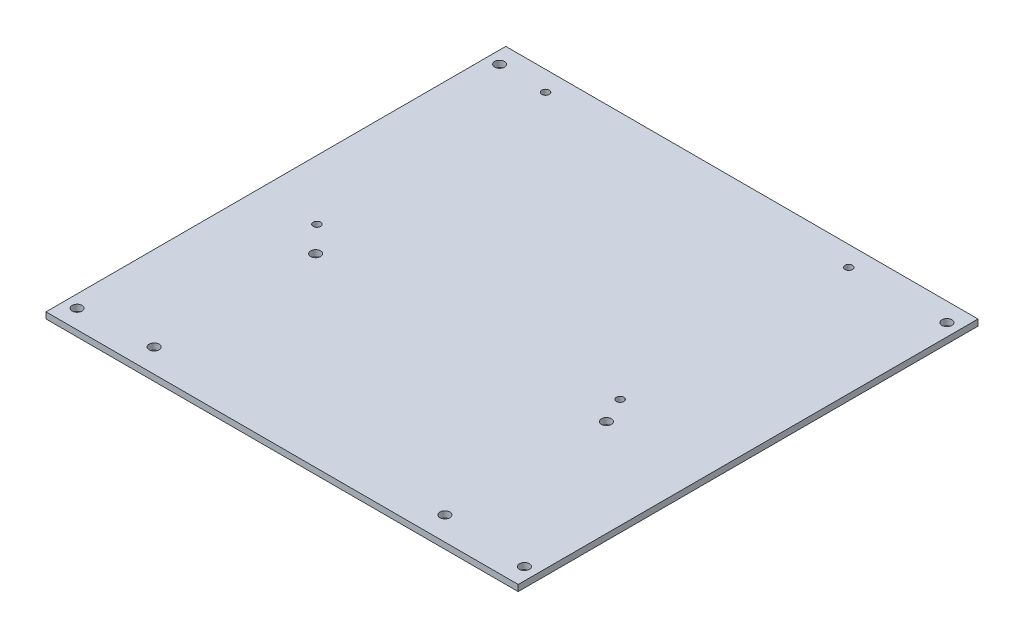
ISO-10303-21;
HEADER;
FILE_DESCRIPTION(('STEP AP214'),'2;1');
FILE_NAME('part.step','',(''),(''),'','','');
FILE_SCHEMA(('AUTOMOTIVE_DESIGN { 1 0 10303 214 1 1 1 1 }'));
ENDSEC;
DATA;
#1=APPLICATION_CONTEXT('core data for automotive mechanical design processes');
#2=APPLICATION_PROTOCOL_DEFINITION('international standard','automotive_design',2000,#1);
#3=PRODUCT_CONTEXT('',#1,'mechanical');
#4=PRODUCT('Part','Part','',(#3));
#5=PRODUCT_RELATED_PRODUCT_CATEGORY('part','',(#4));
#6=PRODUCT_DEFINITION_FORMATION('','',#4);
#7=PRODUCT_DEFINITION_CONTEXT('part definition',#1,'design');
#8=PRODUCT_DEFINITION('design','',#6,#7);
#9=PRODUCT_DEFINITION_SHAPE('','',#8);
#10=(LENGTH_UNIT() NAMED_UNIT(*) SI_UNIT(.MILLI.,.METRE.));
#11=(NAMED_UNIT(*) PLANE_ANGLE_UNIT() SI_UNIT($,.RADIAN.));
#12=(NAMED_UNIT(*) SI_UNIT($,.STERADIAN.) SOLID_ANGLE_UNIT());
#13=UNCERTAINTY_MEASURE_WITH_UNIT(LENGTH_MEASURE(1.E-05),#10,'distance_accuracy_value','');
#14=(GEOMETRIC_REPRESENTATION_CONTEXT(3) GLOBAL_UNCERTAINTY_ASSIGNED_CONTEXT((#13)) GLOBAL_UNIT_ASSIGNED_CONTEXT((#10,
#11,#12)) REPRESENTATION_CONTEXT('',''));
#15=CARTESIAN_POINT('',(0.,0.,0.));
#16=DIRECTION('',(0.,0.,1.));
#17=DIRECTION('',(1.,0.,0.));
#18=AXIS2_PLACEMENT_3D('',#15,#16,#17);
#19=CARTESIAN_POINT('',(95.,2.5,92.5));
#20=DIRECTION('',(-1.,0.,0.));
#21=DIRECTION('',(0.,0.,1.));
#22=AXIS2_PLACEMENT_3D('',#19,#20,#21);
#23=PLANE('',#22);
#24=DIRECTION('',(0.,0.,-1.));
#25=VECTOR('',#24,1.);
#26=CARTESIAN_POINT('',(95.,0.,92.5));
#27=LINE('',#26,#25);
#28=CARTESIAN_POINT('',(95.,0.,92.5));
#29=VERTEX_POINT('',#28);
#30=CARTESIAN_POINT('',(95.,0.,-92.5));
#31=VERTEX_POINT('',#30);
#32=EDGE_CURVE('E99',#29,#31,#27,.T.);
#33=ORIENTED_EDGE('',*,*,#32,.T.);
#34=DIRECTION('',(0.,-1.,0.));
#35=VECTOR('',#34,1.);
#36=CARTESIAN_POINT('',(95.,2.5,-92.5));
#37=LINE('',#36,#35);
#38=CARTESIAN_POINT('',(95.,2.5,-92.5));
#39=VERTEX_POINT('',#38);
#40=EDGE_CURVE('E11',#39,#31,#37,.T.);
#41=ORIENTED_EDGE('',*,*,#40,.F.);
#42=DIRECTION('',(0.,0.,-1.));
#43=VECTOR('',#42,1.);
#44=CARTESIAN_POINT('',(95.,2.5,92.5));
#45=LINE('',#44,#43);
#46=CARTESIAN_POINT('',(95.,2.5,92.5));
#47=VERTEX_POINT('',#46);
#48=EDGE_CURVE('E86',#47,#39,#45,.T.);
#49=ORIENTED_EDGE('',*,*,#48,.F.);
#50=DIRECTION('',(0.,-1.,0.));
#51=VECTOR('',#50,1.);
#52=CARTESIAN_POINT('',(95.,2.5,92.5));
#53=LINE('',#52,#51);
#54=EDGE_CURVE('E95',#47,#29,#53,.T.);
#55=ORIENTED_EDGE('',*,*,#54,.T.);
#56=EDGE_LOOP('',(#33,#41,#49,#55));
#57=FACE_BOUND('',#56,.T.);
#58=ADVANCED_FACE('F33',(#57),#23,.F.);
#59=CARTESIAN_POINT('',(-95.,2.5,-92.5));
#60=DIRECTION('',(0.,0.,1.));
#61=DIRECTION('',(1.,0.,0.));
#62=AXIS2_PLACEMENT_3D('',#59,#60,#61);
#63=PLANE('',#62);
#64=DIRECTION('',(-1.,0.,0.));
#65=VECTOR('',#64,1.);
#66=CARTESIAN_POINT('',(-95.,0.,-92.5));
#67=LINE('',#66,#65);
#68=CARTESIAN_POINT('',(-95.,0.,-92.5));
#69=VERTEX_POINT('',#68);
#70=EDGE_CURVE('E90',#31,#69,#67,.T.);
#71=ORIENTED_EDGE('',*,*,#70,.T.);
#72=DIRECTION('',(0.,-1.,0.));
#73=VECTOR('',#72,1.);
#74=CARTESIAN_POINT('',(-95.,2.5,-92.5));
#75=LINE('',#74,#73);
#76=CARTESIAN_POINT('',(-95.,2.5,-92.5));
#77=VERTEX_POINT('',#76);
#78=EDGE_CURVE('E42',#77,#69,#75,.T.);
#79=ORIENTED_EDGE('',*,*,#78,.F.);
#80=DIRECTION('',(-1.,0.,0.));
#81=VECTOR('',#80,1.);
#82=CARTESIAN_POINT('',(-95.,2.5,-92.5));
#83=LINE('',#82,#81);
#84=EDGE_CURVE('E81',#39,#77,#83,.T.);
#85=ORIENTED_EDGE('',*,*,#84,.F.);
#86=ORIENTED_EDGE('',*,*,#40,.T.);
#87=EDGE_LOOP('',(#71,#79,#85,#86));
#88=FACE_BOUND('',#87,.T.);
#89=ADVANCED_FACE('F89',(#88),#63,.F.);
#90=CARTESIAN_POINT('',(-95.,2.5,92.5));
#91=DIRECTION('',(1.,0.,0.));
#92=DIRECTION('',(0.,0.,-1.));
#93=AXIS2_PLACEMENT_3D('',#90,#91,#92);
#94=PLANE('',#93);
#95=DIRECTION('',(0.,0.,1.));
#96=VECTOR('',#95,1.);
#97=CARTESIAN_POINT('',(-95.,0.,92.5));
#98=LINE('',#97,#96);
#99=CARTESIAN_POINT('',(-95.,0.,92.5));
#100=VERTEX_POINT('',#99);
#101=EDGE_CURVE('E68',#69,#100,#98,.T.);
#102=ORIENTED_EDGE('',*,*,#101,.T.);
#103=DIRECTION('',(0.,-1.,0.));
#104=VECTOR('',#103,1.);
#105=CARTESIAN_POINT('',(-95.,2.5,92.5));
#106=LINE('',#105,#104);
#107=CARTESIAN_POINT('',(-95.,2.5,92.5));
#108=VERTEX_POINT('',#107);
#109=EDGE_CURVE('E91',#108,#100,#106,.T.);
#110=ORIENTED_EDGE('',*,*,#109,.F.);
#111=DIRECTION('',(0.,0.,1.));
#112=VECTOR('',#111,1.);
#113=CARTESIAN_POINT('',(-95.,2.5,92.5));
#114=LINE('',#113,#112);
#115=EDGE_CURVE('E84',#77,#108,#114,.T.);
#116=ORIENTED_EDGE('',*,*,#115,.F.);
#117=ORIENTED_EDGE('',*,*,#78,.T.);
#118=EDGE_LOOP('',(#102,#110,#116,#117));
#119=FACE_BOUND('',#118,.T.);
#120=ADVANCED_FACE('F93',(#119),#94,.F.);
#121=CARTESIAN_POINT('',(-95.,2.5,92.5));
#122=DIRECTION('',(0.,0.,-1.));
#123=DIRECTION('',(-1.,0.,0.));
#124=AXIS2_PLACEMENT_3D('',#121,#122,#123);
#125=PLANE('',#124);
#126=DIRECTION('',(1.,0.,0.));
#127=VECTOR('',#126,1.);
#128=CARTESIAN_POINT('',(-95.,0.,92.5));
#129=LINE('',#128,#127);
#130=EDGE_CURVE('E74',#100,#29,#129,.T.);
#131=ORIENTED_EDGE('',*,*,#130,.T.);
#132=ORIENTED_EDGE('',*,*,#54,.F.);
#133=DIRECTION('',(1.,0.,0.));
#134=VECTOR('',#133,1.);
#135=CARTESIAN_POINT('',(-95.,2.5,92.5));
#136=LINE('',#135,#134);
#137=EDGE_CURVE('E51',#108,#47,#136,.T.);
#138=ORIENTED_EDGE('',*,*,#137,.F.);
#139=ORIENTED_EDGE('',*,*,#109,.T.);
#140=EDGE_LOOP('',(#131,#132,#138,#139));
#141=FACE_BOUND('',#140,.T.);
#142=ADVANCED_FACE('F175',(#141),#125,.F.);
#143=CARTESIAN_POINT('',(0.,2.5,0.));
#144=DIRECTION('',(0.,-1.,0.));
#145=DIRECTION('',(0.,0.,-1.));
#146=AXIS2_PLACEMENT_3D('',#143,#144,#145);
#147=PLANE('',#146);
#148=CARTESIAN_POINT('',(-70.999999999999,2.5,7.50000000000001));
#149=DIRECTION('',(0.,1.,0.));
#150=DIRECTION('',(0.,0.,1.));
#151=AXIS2_PLACEMENT_3D('',#148,#149,#150);
#152=CIRCLE('',#151,1.5);
#153=CARTESIAN_POINT('',(-70.999999999999,2.5,9.00000000000001));
#154=VERTEX_POINT('',#153);
#155=EDGE_CURVE('E337',#154,#154,#152,.T.);
#156=ORIENTED_EDGE('',*,*,#155,.F.);
#157=EDGE_LOOP('',(#156));
#158=FACE_BOUND('',#157,.T.);
#159=CARTESIAN_POINT('',(51.0000000000009,2.5,7.50000000000001));
#160=DIRECTION('',(0.,1.,0.));
#161=DIRECTION('',(0.,0.,1.));
#162=AXIS2_PLACEMENT_3D('',#159,#160,#161);
#163=CIRCLE('',#162,1.5);
#164=CARTESIAN_POINT('',(51.0000000000009,2.5,9.00000000000001));
#165=VERTEX_POINT('',#164);
#166=EDGE_CURVE('E338',#165,#165,#163,.T.);
#167=ORIENTED_EDGE('',*,*,#166,.F.);
#168=EDGE_LOOP('',(#167));
#169=FACE_BOUND('',#168,.T.);
#170=CARTESIAN_POINT('',(51.,2.5,-84.5));
#171=DIRECTION('',(0.,1.,0.));
#172=DIRECTION('',(0.,0.,1.));
#173=AXIS2_PLACEMENT_3D('',#170,#171,#172);
#174=CIRCLE('',#173,1.5);
#175=CARTESIAN_POINT('',(51.,2.5,-83.));
#176=VERTEX_POINT('',#175);
#177=EDGE_CURVE('E341',#176,#176,#174,.T.);
#178=ORIENTED_EDGE('',*,*,#177,.F.);
#179=EDGE_LOOP('',(#178));
#180=FACE_BOUND('',#179,.T.);
#181=CARTESIAN_POINT('',(-71.,2.5,-84.5));
#182=DIRECTION('',(0.,1.,0.));
#183=DIRECTION('',(0.,0.,1.));
#184=AXIS2_PLACEMENT_3D('',#181,#182,#183);
#185=CIRCLE('',#184,1.5);
#186=CARTESIAN_POINT('',(-71.,2.5,-83.));
#187=VERTEX_POINT('',#186);
#188=EDGE_CURVE('E138',#187,#187,#185,.T.);
#189=ORIENTED_EDGE('',*,*,#188,.F.);
#190=EDGE_LOOP('',(#189));
#191=FACE_BOUND('',#190,.T.);
#192=CARTESIAN_POINT('',(55.9999999999998,2.5,18.));
#193=DIRECTION('',(0.,1.,0.));
#194=DIRECTION('',(0.,0.,1.));
#195=AXIS2_PLACEMENT_3D('',#192,#193,#194);
#196=CIRCLE('',#195,2.);
#197=CARTESIAN_POINT('',(55.9999999999998,2.5,20.));
#198=VERTEX_POINT('',#197);
#199=EDGE_CURVE('E145',#198,#198,#196,.T.);
#200=ORIENTED_EDGE('',*,*,#199,.F.);
#201=EDGE_LOOP('',(#200));
#202=FACE_BOUND('',#201,.T.);
#203=CARTESIAN_POINT('',(-61.0000000000002,2.5,18.0000000000008));
#204=DIRECTION('',(0.,1.,0.));
#205=DIRECTION('',(0.,0.,1.));
#206=AXIS2_PLACEMENT_3D('',#203,#204,#205);
#207=CIRCLE('',#206,2.);
#208=CARTESIAN_POINT('',(-61.0000000000002,2.5,20.0000000000008));
#209=VERTEX_POINT('',#208);
#210=EDGE_CURVE('E149',#209,#209,#207,.T.);
#211=ORIENTED_EDGE('',*,*,#210,.F.);
#212=EDGE_LOOP('',(#211));
#213=FACE_BOUND('',#212,.T.);
#214=CARTESIAN_POINT('',(-61.,2.5,83.0000000000008));
#215=DIRECTION('',(0.,1.,0.));
#216=DIRECTION('',(0.,0.,1.));
#217=AXIS2_PLACEMENT_3D('',#214,#215,#216);
#218=CIRCLE('',#217,2.);
#219=CARTESIAN_POINT('',(-61.,2.5,85.0000000000008));
#220=VERTEX_POINT('',#219);
#221=EDGE_CURVE('E154',#220,#220,#218,.T.);
#222=ORIENTED_EDGE('',*,*,#221,.F.);
#223=EDGE_LOOP('',(#222));
#224=FACE_BOUND('',#223,.T.);
#225=CARTESIAN_POINT('',(56.,2.5,83.));
#226=DIRECTION('',(0.,1.,0.));
#227=DIRECTION('',(0.,0.,1.));
#228=AXIS2_PLACEMENT_3D('',#225,#226,#227);
#229=CIRCLE('',#228,2.);
#230=CARTESIAN_POINT('',(56.,2.5,85.));
#231=VERTEX_POINT('',#230);
#232=EDGE_CURVE('E124',#231,#231,#229,.T.);
#233=ORIENTED_EDGE('',*,*,#232,.F.);
#234=EDGE_LOOP('',(#233));
#235=FACE_BOUND('',#234,.T.);
#236=CARTESIAN_POINT('',(90.0000000000018,2.5,84.9999999999987));
#237=DIRECTION('',(0.,1.,0.));
#238=DIRECTION('',(0.,0.,1.));
#239=AXIS2_PLACEMENT_3D('',#236,#237,#238);
#240=CIRCLE('',#239,2.);
#241=CARTESIAN_POINT('',(90.0000000000018,2.5,86.9999999999987));
#242=VERTEX_POINT('',#241);
#243=EDGE_CURVE('E133',#242,#242,#240,.T.);
#244=ORIENTED_EDGE('',*,*,#243,.F.);
#245=EDGE_LOOP('',(#244));
#246=FACE_BOUND('',#245,.T.);
#247=CARTESIAN_POINT('',(-89.9999999999982,2.5,85.));
#248=DIRECTION('',(0.,1.,0.));
#249=DIRECTION('',(0.,0.,1.));
#250=AXIS2_PLACEMENT_3D('',#247,#248,#249);
#251=CIRCLE('',#250,2.);
#252=CARTESIAN_POINT('',(-89.9999999999982,2.5,87.));
#253=VERTEX_POINT('',#252);
#254=EDGE_CURVE('E163',#253,#253,#251,.T.);
#255=ORIENTED_EDGE('',*,*,#254,.F.);
#256=EDGE_LOOP('',(#255));
#257=FACE_BOUND('',#256,.T.);
#258=CARTESIAN_POINT('',(-90.,2.5,-84.9999999999987));
#259=DIRECTION('',(0.,1.,0.));
#260=DIRECTION('',(0.,0.,1.));
#261=AXIS2_PLACEMENT_3D('',#258,#259,#260);
#262=CIRCLE('',#261,2.);
#263=CARTESIAN_POINT('',(-90.,2.5,-82.9999999999987));
#264=VERTEX_POINT('',#263);
#265=EDGE_CURVE('E160',#264,#264,#262,.T.);
#266=ORIENTED_EDGE('',*,*,#265,.F.);
#267=EDGE_LOOP('',(#266));
#268=FACE_BOUND('',#267,.T.);
#269=CARTESIAN_POINT('',(90.,2.5,-85.));
#270=DIRECTION('',(0.,1.,0.));
#271=DIRECTION('',(0.,0.,1.));
#272=AXIS2_PLACEMENT_3D('',#269,#270,#271);
#273=CIRCLE('',#272,2.);
#274=CARTESIAN_POINT('',(90.,2.5,-83.));
#275=VERTEX_POINT('',#274);
#276=EDGE_CURVE('E112',#275,#275,#273,.T.);
#277=ORIENTED_EDGE('',*,*,#276,.F.);
#278=EDGE_LOOP('',(#277));
#279=FACE_BOUND('',#278,.T.);
#280=ORIENTED_EDGE('',*,*,#48,.T.);
#281=ORIENTED_EDGE('',*,*,#84,.T.);
#282=ORIENTED_EDGE('',*,*,#115,.T.);
#283=ORIENTED_EDGE('',*,*,#137,.T.);
#284=EDGE_LOOP('',(#280,#281,#282,#283));
#285=FACE_BOUND('',#284,.T.);
#286=ADVANCED_FACE('F82',(#158,#169,#180,#191,#202,#213,#224,#235,#246,#257,#268,#279,#285),
#147,.F.);
#287=CARTESIAN_POINT('',(0.,0.,0.));
#288=DIRECTION('',(0.,-1.,0.));
#289=DIRECTION('',(0.,0.,-1.));
#290=AXIS2_PLACEMENT_3D('',#287,#288,#289);
#291=PLANE('',#290);
#292=CARTESIAN_POINT('',(-70.999999999999,0.,7.50000000000001));
#293=DIRECTION('',(0.,-1.,0.));
#294=DIRECTION('',(0.,0.,-1.));
#295=AXIS2_PLACEMENT_3D('',#292,#293,#294);
#296=CIRCLE('',#295,1.5);
#297=CARTESIAN_POINT('',(-70.999999999999,0.,6.00000000000001));
#298=VERTEX_POINT('',#297);
#299=EDGE_CURVE('E36',#298,#298,#296,.T.);
#300=ORIENTED_EDGE('',*,*,#299,.F.);
#301=EDGE_LOOP('',(#300));
#302=FACE_BOUND('',#301,.T.);
#303=CARTESIAN_POINT('',(51.0000000000009,0.,7.50000000000001));
#304=DIRECTION('',(0.,-1.,0.));
#305=DIRECTION('',(0.,0.,-1.));
#306=AXIS2_PLACEMENT_3D('',#303,#304,#305);
#307=CIRCLE('',#306,1.5);
#308=CARTESIAN_POINT('',(51.0000000000009,0.,6.00000000000001));
#309=VERTEX_POINT('',#308);
#310=EDGE_CURVE('E140',#309,#309,#307,.T.);
#311=ORIENTED_EDGE('',*,*,#310,.F.);
#312=EDGE_LOOP('',(#311));
#313=FACE_BOUND('',#312,.T.);
#314=CARTESIAN_POINT('',(51.,0.,-84.5));
#315=DIRECTION('',(0.,-1.,0.));
#316=DIRECTION('',(0.,0.,-1.));
#317=AXIS2_PLACEMENT_3D('',#314,#315,#316);
#318=CIRCLE('',#317,1.5);
#319=CARTESIAN_POINT('',(51.,0.,-86.));
#320=VERTEX_POINT('',#319);
#321=EDGE_CURVE('E137',#320,#320,#318,.T.);
#322=ORIENTED_EDGE('',*,*,#321,.F.);
#323=EDGE_LOOP('',(#322));
#324=FACE_BOUND('',#323,.T.);
#325=CARTESIAN_POINT('',(-71.,0.,-84.5));
#326=DIRECTION('',(0.,-1.,0.));
#327=DIRECTION('',(0.,0.,-1.));
#328=AXIS2_PLACEMENT_3D('',#325,#326,#327);
#329=CIRCLE('',#328,1.5);
#330=CARTESIAN_POINT('',(-71.,0.,-86.));
#331=VERTEX_POINT('',#330);
#332=EDGE_CURVE('E134',#331,#331,#329,.T.);
#333=ORIENTED_EDGE('',*,*,#332,.F.);
#334=EDGE_LOOP('',(#333));
#335=FACE_BOUND('',#334,.T.);
#336=CARTESIAN_POINT('',(55.9999999999998,0.,18.));
#337=DIRECTION('',(0.,-1.,0.));
#338=DIRECTION('',(0.,0.,-1.));
#339=AXIS2_PLACEMENT_3D('',#336,#337,#338);
#340=CIRCLE('',#339,2.);
#341=CARTESIAN_POINT('',(55.9999999999998,0.,16.));
#342=VERTEX_POINT('',#341);
#343=EDGE_CURVE('E130',#342,#342,#340,.T.);
#344=ORIENTED_EDGE('',*,*,#343,.F.);
#345=EDGE_LOOP('',(#344));
#346=FACE_BOUND('',#345,.T.);
#347=CARTESIAN_POINT('',(-61.0000000000002,0.,18.0000000000008));
#348=DIRECTION('',(0.,-1.,0.));
#349=DIRECTION('',(0.,0.,-1.));
#350=AXIS2_PLACEMENT_3D('',#347,#348,#349);
#351=CIRCLE('',#350,2.);
#352=CARTESIAN_POINT('',(-61.0000000000002,0.,16.0000000000008));
#353=VERTEX_POINT('',#352);
#354=EDGE_CURVE('E127',#353,#353,#351,.T.);
#355=ORIENTED_EDGE('',*,*,#354,.F.);
#356=EDGE_LOOP('',(#355));
#357=FACE_BOUND('',#356,.T.);
#358=CARTESIAN_POINT('',(-61.,0.,83.0000000000008));
#359=DIRECTION('',(0.,-1.,0.));
#360=DIRECTION('',(0.,0.,-1.));
#361=AXIS2_PLACEMENT_3D('',#358,#359,#360);
#362=CIRCLE('',#361,2.);
#363=CARTESIAN_POINT('',(-61.,0.,81.0000000000008));
#364=VERTEX_POINT('',#363);
#365=EDGE_CURVE('E123',#364,#364,#362,.T.);
#366=ORIENTED_EDGE('',*,*,#365,.F.);
#367=EDGE_LOOP('',(#366));
#368=FACE_BOUND('',#367,.T.);
#369=CARTESIAN_POINT('',(56.,0.,83.));
#370=DIRECTION('',(0.,-1.,0.));
#371=DIRECTION('',(0.,0.,-1.));
#372=AXIS2_PLACEMENT_3D('',#369,#370,#371);
#373=CIRCLE('',#372,2.);
#374=CARTESIAN_POINT('',(56.,0.,81.));
#375=VERTEX_POINT('',#374);
#376=EDGE_CURVE('E120',#375,#375,#373,.T.);
#377=ORIENTED_EDGE('',*,*,#376,.F.);
#378=EDGE_LOOP('',(#377));
#379=FACE_BOUND('',#378,.T.);
#380=CARTESIAN_POINT('',(90.0000000000018,0.,84.9999999999987));
#381=DIRECTION('',(0.,-1.,0.));
#382=DIRECTION('',(0.,0.,-1.));
#383=AXIS2_PLACEMENT_3D('',#380,#381,#382);
#384=CIRCLE('',#383,2.);
#385=CARTESIAN_POINT('',(90.0000000000018,0.,82.9999999999987));
#386=VERTEX_POINT('',#385);
#387=EDGE_CURVE('E102',#386,#386,#384,.T.);
#388=ORIENTED_EDGE('',*,*,#387,.F.);
#389=EDGE_LOOP('',(#388));
#390=FACE_BOUND('',#389,.T.);
#391=CARTESIAN_POINT('',(-89.9999999999982,0.,85.));
#392=DIRECTION('',(0.,-1.,0.));
#393=DIRECTION('',(0.,0.,-1.));
#394=AXIS2_PLACEMENT_3D('',#391,#392,#393);
#395=CIRCLE('',#394,2.);
#396=CARTESIAN_POINT('',(-89.9999999999982,0.,83.));
#397=VERTEX_POINT('',#396);
#398=EDGE_CURVE('E115',#397,#397,#395,.T.);
#399=ORIENTED_EDGE('',*,*,#398,.F.);
#400=EDGE_LOOP('',(#399));
#401=FACE_BOUND('',#400,.T.);
#402=CARTESIAN_POINT('',(-90.,0.,-84.9999999999987));
#403=DIRECTION('',(0.,-1.,0.));
#404=DIRECTION('',(0.,0.,-1.));
#405=AXIS2_PLACEMENT_3D('',#402,#403,#404);
#406=CIRCLE('',#405,2.);
#407=CARTESIAN_POINT('',(-90.,0.,-86.9999999999987));
#408=VERTEX_POINT('',#407);
#409=EDGE_CURVE('E111',#408,#408,#406,.T.);
#410=ORIENTED_EDGE('',*,*,#409,.F.);
#411=EDGE_LOOP('',(#410));
#412=FACE_BOUND('',#411,.T.);
#413=CARTESIAN_POINT('',(90.,0.,-85.));
#414=DIRECTION('',(0.,-1.,0.));
#415=DIRECTION('',(0.,0.,-1.));
#416=AXIS2_PLACEMENT_3D('',#413,#414,#415);
#417=CIRCLE('',#416,2.);
#418=CARTESIAN_POINT('',(90.,0.,-87.));
#419=VERTEX_POINT('',#418);
#420=EDGE_CURVE('E108',#419,#419,#417,.T.);
#421=ORIENTED_EDGE('',*,*,#420,.F.);
#422=EDGE_LOOP('',(#421));
#423=FACE_BOUND('',#422,.T.);
#424=ORIENTED_EDGE('',*,*,#32,.F.);
#425=ORIENTED_EDGE('',*,*,#130,.F.);
#426=ORIENTED_EDGE('',*,*,#101,.F.);
#427=ORIENTED_EDGE('',*,*,#70,.F.);
#428=EDGE_LOOP('',(#424,#425,#426,#427));
#429=FACE_BOUND('',#428,.T.);
#430=ADVANCED_FACE('F174',(#302,#313,#324,#335,#346,#357,#368,#379,#390,#401,#412,#423,#429),
#291,.T.);
#431=CARTESIAN_POINT('',(90.,-7.5,-85.));
#432=DIRECTION('',(0.,1.,0.));
#433=DIRECTION('',(0.,0.,1.));
#434=AXIS2_PLACEMENT_3D('',#431,#432,#433);
#435=CYLINDRICAL_SURFACE('',#434,2.);
#436=ORIENTED_EDGE('',*,*,#420,.T.);
#437=EDGE_LOOP('',(#436));
#438=FACE_BOUND('',#437,.T.);
#439=ORIENTED_EDGE('',*,*,#276,.T.);
#440=EDGE_LOOP('',(#439));
#441=FACE_BOUND('',#440,.T.);
#442=ADVANCED_FACE('F171',(#438,#441),#435,.F.);
#443=CARTESIAN_POINT('',(-90.,-7.5,-84.9999999999987));
#444=DIRECTION('',(0.,1.,0.));
#445=DIRECTION('',(0.,0.,1.));
#446=AXIS2_PLACEMENT_3D('',#443,#444,#445);
#447=CYLINDRICAL_SURFACE('',#446,2.);
#448=ORIENTED_EDGE('',*,*,#409,.T.);
#449=EDGE_LOOP('',(#448));
#450=FACE_BOUND('',#449,.T.);
#451=ORIENTED_EDGE('',*,*,#265,.T.);
#452=EDGE_LOOP('',(#451));
#453=FACE_BOUND('',#452,.T.);
#454=ADVANCED_FACE('F215',(#450,#453),#447,.F.);
#455=CARTESIAN_POINT('',(-89.9999999999982,-7.5,85.));
#456=DIRECTION('',(0.,1.,0.));
#457=DIRECTION('',(0.,0.,1.));
#458=AXIS2_PLACEMENT_3D('',#455,#456,#457);
#459=CYLINDRICAL_SURFACE('',#458,2.);
#460=ORIENTED_EDGE('',*,*,#398,.T.);
#461=EDGE_LOOP('',(#460));
#462=FACE_BOUND('',#461,.T.);
#463=ORIENTED_EDGE('',*,*,#254,.T.);
#464=EDGE_LOOP('',(#463));
#465=FACE_BOUND('',#464,.T.);
#466=ADVANCED_FACE('F225',(#462,#465),#459,.F.);
#467=CARTESIAN_POINT('',(90.0000000000018,-7.5,84.9999999999987));
#468=DIRECTION('',(0.,1.,0.));
#469=DIRECTION('',(0.,0.,1.));
#470=AXIS2_PLACEMENT_3D('',#467,#468,#469);
#471=CYLINDRICAL_SURFACE('',#470,2.);
#472=ORIENTED_EDGE('',*,*,#387,.T.);
#473=EDGE_LOOP('',(#472));
#474=FACE_BOUND('',#473,.T.);
#475=ORIENTED_EDGE('',*,*,#243,.T.);
#476=EDGE_LOOP('',(#475));
#477=FACE_BOUND('',#476,.T.);
#478=ADVANCED_FACE('F235',(#474,#477),#471,.F.);
#479=CARTESIAN_POINT('',(56.,-7.5,83.));
#480=DIRECTION('',(0.,1.,0.));
#481=DIRECTION('',(0.,0.,1.));
#482=AXIS2_PLACEMENT_3D('',#479,#480,#481);
#483=CYLINDRICAL_SURFACE('',#482,2.);
#484=ORIENTED_EDGE('',*,*,#376,.T.);
#485=EDGE_LOOP('',(#484));
#486=FACE_BOUND('',#485,.T.);
#487=ORIENTED_EDGE('',*,*,#232,.T.);
#488=EDGE_LOOP('',(#487));
#489=FACE_BOUND('',#488,.T.);
#490=ADVANCED_FACE('F245',(#486,#489),#483,.F.);
#491=CARTESIAN_POINT('',(-61.,-7.5,83.0000000000008));
#492=DIRECTION('',(0.,1.,0.));
#493=DIRECTION('',(0.,0.,1.));
#494=AXIS2_PLACEMENT_3D('',#491,#492,#493);
#495=CYLINDRICAL_SURFACE('',#494,2.);
#496=ORIENTED_EDGE('',*,*,#365,.T.);
#497=EDGE_LOOP('',(#496));
#498=FACE_BOUND('',#497,.T.);
#499=ORIENTED_EDGE('',*,*,#221,.T.);
#500=EDGE_LOOP('',(#499));
#501=FACE_BOUND('',#500,.T.);
#502=ADVANCED_FACE('F255',(#498,#501),#495,.F.);
#503=CARTESIAN_POINT('',(-61.0000000000002,-7.5,18.0000000000008));
#504=DIRECTION('',(0.,1.,0.));
#505=DIRECTION('',(0.,0.,1.));
#506=AXIS2_PLACEMENT_3D('',#503,#504,#505);
#507=CYLINDRICAL_SURFACE('',#506,2.);
#508=ORIENTED_EDGE('',*,*,#354,.T.);
#509=EDGE_LOOP('',(#508));
#510=FACE_BOUND('',#509,.T.);
#511=ORIENTED_EDGE('',*,*,#210,.T.);
#512=EDGE_LOOP('',(#511));
#513=FACE_BOUND('',#512,.T.);
#514=ADVANCED_FACE('F265',(#510,#513),#507,.F.);
#515=CARTESIAN_POINT('',(55.9999999999998,-7.5,18.));
#516=DIRECTION('',(0.,1.,0.));
#517=DIRECTION('',(0.,0.,1.));
#518=AXIS2_PLACEMENT_3D('',#515,#516,#517);
#519=CYLINDRICAL_SURFACE('',#518,2.);
#520=ORIENTED_EDGE('',*,*,#343,.T.);
#521=EDGE_LOOP('',(#520));
#522=FACE_BOUND('',#521,.T.);
#523=ORIENTED_EDGE('',*,*,#199,.T.);
#524=EDGE_LOOP('',(#523));
#525=FACE_BOUND('',#524,.T.);
#526=ADVANCED_FACE('F275',(#522,#525),#519,.F.);
#527=CARTESIAN_POINT('',(-71.,-7.5,-84.5));
#528=DIRECTION('',(0.,1.,0.));
#529=DIRECTION('',(0.,0.,1.));
#530=AXIS2_PLACEMENT_3D('',#527,#528,#529);
#531=CYLINDRICAL_SURFACE('',#530,1.5);
#532=ORIENTED_EDGE('',*,*,#332,.T.);
#533=EDGE_LOOP('',(#532));
#534=FACE_BOUND('',#533,.T.);
#535=ORIENTED_EDGE('',*,*,#188,.T.);
#536=EDGE_LOOP('',(#535));
#537=FACE_BOUND('',#536,.T.);
#538=ADVANCED_FACE('F284',(#534,#537),#531,.F.);
#539=CARTESIAN_POINT('',(51.,-7.5,-84.5));
#540=DIRECTION('',(0.,1.,0.));
#541=DIRECTION('',(0.,0.,1.));
#542=AXIS2_PLACEMENT_3D('',#539,#540,#541);
#543=CYLINDRICAL_SURFACE('',#542,1.5);
#544=ORIENTED_EDGE('',*,*,#321,.T.);
#545=EDGE_LOOP('',(#544));
#546=FACE_BOUND('',#545,.T.);
#547=ORIENTED_EDGE('',*,*,#177,.T.);
#548=EDGE_LOOP('',(#547));
#549=FACE_BOUND('',#548,.T.);
#550=ADVANCED_FACE('F303',(#546,#549),#543,.F.);
#551=CARTESIAN_POINT('',(51.0000000000009,-7.5,7.50000000000001));
#552=DIRECTION('',(0.,1.,0.));
#553=DIRECTION('',(0.,0.,1.));
#554=AXIS2_PLACEMENT_3D('',#551,#552,#553);
#555=CYLINDRICAL_SURFACE('',#554,1.5);
#556=ORIENTED_EDGE('',*,*,#310,.T.);
#557=EDGE_LOOP('',(#556));
#558=FACE_BOUND('',#557,.T.);
#559=ORIENTED_EDGE('',*,*,#166,.T.);
#560=EDGE_LOOP('',(#559));
#561=FACE_BOUND('',#560,.T.);
#562=ADVANCED_FACE('F313',(#558,#561),#555,.F.);
#563=CARTESIAN_POINT('',(-70.999999999999,-7.5,7.50000000000001));
#564=DIRECTION('',(0.,1.,0.));
#565=DIRECTION('',(0.,0.,1.));
#566=AXIS2_PLACEMENT_3D('',#563,#564,#565);
#567=CYLINDRICAL_SURFACE('',#566,1.5);
#568=ORIENTED_EDGE('',*,*,#299,.T.);
#569=EDGE_LOOP('',(#568));
#570=FACE_BOUND('',#569,.T.);
#571=ORIENTED_EDGE('',*,*,#155,.T.);
#572=EDGE_LOOP('',(#571));
#573=FACE_BOUND('',#572,.T.);
#574=ADVANCED_FACE('F323',(#570,#573),#567,.F.);
#575=CLOSED_SHELL('',(#58,#89,#120,#142,#286,#430,#442,#454,#466,#478,#490,#502,#514,#526,#538,
#550,#562,#574));
#576=MANIFOLD_SOLID_BREP('B2',#575);
#577=ADVANCED_BREP_SHAPE_REPRESENTATION('',(#18,#576),#14);
#578=SHAPE_DEFINITION_REPRESENTATION(#9,#577);
ENDSEC;
END-ISO-10303-21;
